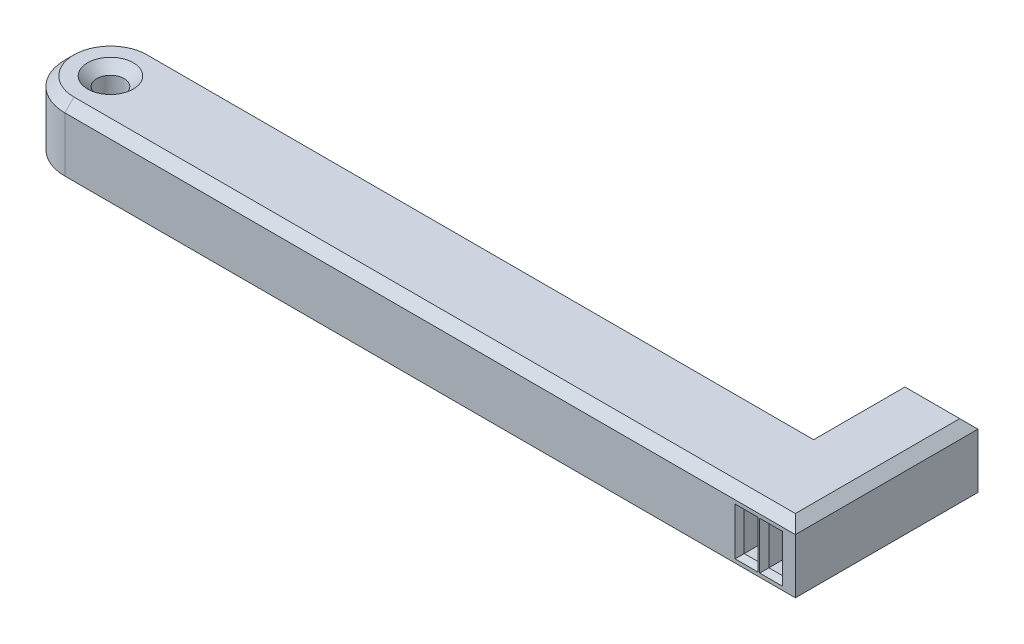
ISO-10303-21;
HEADER;
FILE_DESCRIPTION(('STEP AP214'),'2;1');
FILE_NAME('part.step','',(''),(''),'','','');
FILE_SCHEMA(('AUTOMOTIVE_DESIGN { 1 0 10303 214 1 1 1 1 }'));
ENDSEC;
DATA;
#1=APPLICATION_CONTEXT('core data for automotive mechanical design processes');
#2=APPLICATION_PROTOCOL_DEFINITION('international standard','automotive_design',2000,#1);
#3=PRODUCT_CONTEXT('',#1,'mechanical');
#4=PRODUCT('Part','Part','',(#3));
#5=PRODUCT_RELATED_PRODUCT_CATEGORY('part','',(#4));
#6=PRODUCT_DEFINITION_FORMATION('','',#4);
#7=PRODUCT_DEFINITION_CONTEXT('part definition',#1,'design');
#8=PRODUCT_DEFINITION('design','',#6,#7);
#9=PRODUCT_DEFINITION_SHAPE('','',#8);
#10=(LENGTH_UNIT() NAMED_UNIT(*) SI_UNIT(.MILLI.,.METRE.));
#11=(NAMED_UNIT(*) PLANE_ANGLE_UNIT() SI_UNIT($,.RADIAN.));
#12=(NAMED_UNIT(*) SI_UNIT($,.STERADIAN.) SOLID_ANGLE_UNIT());
#13=UNCERTAINTY_MEASURE_WITH_UNIT(LENGTH_MEASURE(1.E-05),#10,'distance_accuracy_value','');
#14=(GEOMETRIC_REPRESENTATION_CONTEXT(3) GLOBAL_UNCERTAINTY_ASSIGNED_CONTEXT((#13)) GLOBAL_UNIT_ASSIGNED_CONTEXT((#10,
#11,#12)) REPRESENTATION_CONTEXT('',''));
#15=CARTESIAN_POINT('',(0.,0.,0.));
#16=DIRECTION('',(0.,0.,1.));
#17=DIRECTION('',(1.,0.,0.));
#18=AXIS2_PLACEMENT_3D('',#15,#16,#17);
#19=CARTESIAN_POINT('',(0.,8.,-5.));
#20=DIRECTION('',(0.,0.,-1.));
#21=DIRECTION('',(-1.,0.,0.));
#22=AXIS2_PLACEMENT_3D('',#19,#20,#21);
#23=PLANE('',#22);
#24=DIRECTION('',(0.,-1.,0.));
#25=VECTOR('',#24,1.);
#26=CARTESIAN_POINT('',(0.,8.,-5.));
#27=LINE('',#26,#25);
#28=CARTESIAN_POINT('',(0.,7.00000000000001,-5.));
#29=VERTEX_POINT('',#28);
#30=CARTESIAN_POINT('',(0.,0.999999999999994,-5.));
#31=VERTEX_POINT('',#30);
#32=EDGE_CURVE('E291',#29,#31,#27,.T.);
#33=ORIENTED_EDGE('',*,*,#32,.F.);
#34=DIRECTION('',(1.,0.,0.));
#35=VECTOR('',#34,1.);
#36=CARTESIAN_POINT('',(0.,7.00000000000001,-5.));
#37=LINE('',#36,#35);
#38=CARTESIAN_POINT('',(72.,7.00000000000001,-4.99999999999999));
#39=VERTEX_POINT('',#38);
#40=EDGE_CURVE('E361',#29,#39,#37,.T.);
#41=ORIENTED_EDGE('',*,*,#40,.T.);
#42=DIRECTION('',(0.,-1.,0.));
#43=VECTOR('',#42,1.);
#44=CARTESIAN_POINT('',(72.,8.,-4.99999999999999));
#45=LINE('',#44,#43);
#46=CARTESIAN_POINT('',(72.,0.999999999999994,-4.99999999999999));
#47=VERTEX_POINT('',#46);
#48=EDGE_CURVE('E264',#39,#47,#45,.T.);
#49=ORIENTED_EDGE('',*,*,#48,.T.);
#50=DIRECTION('',(-1.,0.,0.));
#51=VECTOR('',#50,1.);
#52=CARTESIAN_POINT('',(0.,0.999999999999994,-5.));
#53=LINE('',#52,#51);
#54=EDGE_CURVE('E358',#47,#31,#53,.T.);
#55=ORIENTED_EDGE('',*,*,#54,.T.);
#56=EDGE_LOOP('',(#33,#41,#49,#55));
#57=FACE_BOUND('',#56,.T.);
#58=ADVANCED_FACE('F43',(#57),#23,.T.);
#59=CARTESIAN_POINT('',(0.,8.,0.));
#60=DIRECTION('',(0.,-1.,0.));
#61=DIRECTION('',(0.,0.,-1.));
#62=AXIS2_PLACEMENT_3D('',#59,#60,#61);
#63=CYLINDRICAL_SURFACE('',#62,5.);
#64=DIRECTION('',(0.,-1.,0.));
#65=VECTOR('',#64,1.);
#66=CARTESIAN_POINT('',(0.,8.,5.));
#67=LINE('',#66,#65);
#68=CARTESIAN_POINT('',(0.,7.00000000000001,5.));
#69=VERTEX_POINT('',#68);
#70=CARTESIAN_POINT('',(0.,0.999999999999994,5.));
#71=VERTEX_POINT('',#70);
#72=EDGE_CURVE('E287',#69,#71,#67,.T.);
#73=ORIENTED_EDGE('',*,*,#72,.F.);
#74=CARTESIAN_POINT('',(0.,7.00000000000001,0.));
#75=DIRECTION('',(0.,1.,0.));
#76=DIRECTION('',(0.,0.,1.));
#77=AXIS2_PLACEMENT_3D('',#74,#75,#76);
#78=CIRCLE('',#77,5.);
#79=EDGE_CURVE('E355',#69,#29,#78,.F.);
#80=ORIENTED_EDGE('',*,*,#79,.T.);
#81=ORIENTED_EDGE('',*,*,#32,.T.);
#82=CARTESIAN_POINT('',(0.,0.999999999999994,0.));
#83=DIRECTION('',(0.,1.,0.));
#84=DIRECTION('',(0.,0.,1.));
#85=AXIS2_PLACEMENT_3D('',#82,#83,#84);
#86=CIRCLE('',#85,5.);
#87=EDGE_CURVE('E351',#31,#71,#86,.T.);
#88=ORIENTED_EDGE('',*,*,#87,.T.);
#89=EDGE_LOOP('',(#73,#80,#81,#88));
#90=FACE_BOUND('',#89,.T.);
#91=ADVANCED_FACE('F599',(#90),#63,.T.);
#92=CARTESIAN_POINT('',(0.,8.,5.));
#93=DIRECTION('',(0.,0.,1.));
#94=DIRECTION('',(1.,0.,0.));
#95=AXIS2_PLACEMENT_3D('',#92,#93,#94);
#96=PLANE('',#95);
#97=DIRECTION('',(0.,1.,0.));
#98=VECTOR('',#97,1.);
#99=CARTESIAN_POINT('',(73.4,6.1,4.99999999999999));
#100=LINE('',#99,#98);
#101=CARTESIAN_POINT('',(73.4,1.4,4.99999999999999));
#102=VERTEX_POINT('',#101);
#103=CARTESIAN_POINT('',(73.4,6.6,4.99999999999999));
#104=VERTEX_POINT('',#103);
#105=EDGE_CURVE('E451',#102,#104,#100,.T.);
#106=ORIENTED_EDGE('',*,*,#105,.T.);
#107=DIRECTION('',(1.,0.,0.));
#108=VECTOR('',#107,1.);
#109=CARTESIAN_POINT('',(75.4,6.6,4.99999999999999));
#110=LINE('',#109,#108);
#111=CARTESIAN_POINT('',(75.9,6.6,4.99999999999999));
#112=VERTEX_POINT('',#111);
#113=EDGE_CURVE('E454',#104,#112,#110,.T.);
#114=ORIENTED_EDGE('',*,*,#113,.T.);
#115=DIRECTION('',(0.,-1.,0.));
#116=VECTOR('',#115,1.);
#117=CARTESIAN_POINT('',(75.9,1.9,4.99999999999999));
#118=LINE('',#117,#116);
#119=CARTESIAN_POINT('',(75.9,1.4,4.99999999999999));
#120=VERTEX_POINT('',#119);
#121=EDGE_CURVE('E445',#112,#120,#118,.T.);
#122=ORIENTED_EDGE('',*,*,#121,.T.);
#123=DIRECTION('',(-1.,0.,0.));
#124=VECTOR('',#123,1.);
#125=CARTESIAN_POINT('',(73.9,1.4,4.99999999999999));
#126=LINE('',#125,#124);
#127=EDGE_CURVE('E448',#120,#102,#126,.T.);
#128=ORIENTED_EDGE('',*,*,#127,.T.);
#129=EDGE_LOOP('',(#106,#114,#122,#128));
#130=FACE_BOUND('',#129,.T.);
#131=DIRECTION('',(0.,1.,0.));
#132=VECTOR('',#131,1.);
#133=CARTESIAN_POINT('',(76.1,6.1,4.99999999999999));
#134=LINE('',#133,#132);
#135=CARTESIAN_POINT('',(76.1,1.4,4.99999999999999));
#136=VERTEX_POINT('',#135);
#137=CARTESIAN_POINT('',(76.1,6.6,4.99999999999999));
#138=VERTEX_POINT('',#137);
#139=EDGE_CURVE('E438',#136,#138,#134,.T.);
#140=ORIENTED_EDGE('',*,*,#139,.T.);
#141=DIRECTION('',(1.,0.,0.));
#142=VECTOR('',#141,1.);
#143=CARTESIAN_POINT('',(78.1,6.6,4.99999999999999));
#144=LINE('',#143,#142);
#145=CARTESIAN_POINT('',(78.6,6.6,4.99999999999999));
#146=VERTEX_POINT('',#145);
#147=EDGE_CURVE('E441',#138,#146,#144,.T.);
#148=ORIENTED_EDGE('',*,*,#147,.T.);
#149=DIRECTION('',(0.,-1.,0.));
#150=VECTOR('',#149,1.);
#151=CARTESIAN_POINT('',(78.6,1.9,4.99999999999999));
#152=LINE('',#151,#150);
#153=CARTESIAN_POINT('',(78.6,1.4,4.99999999999999));
#154=VERTEX_POINT('',#153);
#155=EDGE_CURVE('E387',#146,#154,#152,.T.);
#156=ORIENTED_EDGE('',*,*,#155,.T.);
#157=DIRECTION('',(-1.,0.,0.));
#158=VECTOR('',#157,1.);
#159=CARTESIAN_POINT('',(76.6,1.4,4.99999999999999));
#160=LINE('',#159,#158);
#161=EDGE_CURVE('E435',#154,#136,#160,.T.);
#162=ORIENTED_EDGE('',*,*,#161,.T.);
#163=EDGE_LOOP('',(#140,#148,#156,#162));
#164=FACE_BOUND('',#163,.T.);
#165=DIRECTION('',(0.,-1.,0.));
#166=VECTOR('',#165,1.);
#167=CARTESIAN_POINT('',(80.,8.,4.99999999999999));
#168=LINE('',#167,#166);
#169=CARTESIAN_POINT('',(80.,7.00000000000001,4.99999999999999));
#170=VERTEX_POINT('',#169);
#171=CARTESIAN_POINT('',(80.,0.999999999999994,4.99999999999999));
#172=VERTEX_POINT('',#171);
#173=EDGE_CURVE('E283',#170,#172,#168,.T.);
#174=ORIENTED_EDGE('',*,*,#173,.F.);
#175=DIRECTION('',(-1.,0.,0.));
#176=VECTOR('',#175,1.);
#177=CARTESIAN_POINT('',(0.,7.00000000000001,5.));
#178=LINE('',#177,#176);
#179=EDGE_CURVE('E348',#170,#69,#178,.T.);
#180=ORIENTED_EDGE('',*,*,#179,.T.);
#181=ORIENTED_EDGE('',*,*,#72,.T.);
#182=DIRECTION('',(1.,0.,0.));
#183=VECTOR('',#182,1.);
#184=CARTESIAN_POINT('',(80.,0.999999999999994,4.99999999999999));
#185=LINE('',#184,#183);
#186=EDGE_CURVE('E345',#71,#172,#185,.T.);
#187=ORIENTED_EDGE('',*,*,#186,.T.);
#188=EDGE_LOOP('',(#174,#180,#181,#187));
#189=FACE_BOUND('',#188,.T.);
#190=ADVANCED_FACE('F573',(#130,#164,#189),#96,.T.);
#191=CARTESIAN_POINT('',(80.,8.,0.));
#192=DIRECTION('',(1.,0.,0.));
#193=DIRECTION('',(0.,0.,-1.));
#194=AXIS2_PLACEMENT_3D('',#191,#192,#193);
#195=PLANE('',#194);
#196=DIRECTION('',(0.,-1.,0.));
#197=VECTOR('',#196,1.);
#198=CARTESIAN_POINT('',(80.,8.,-15.));
#199=LINE('',#198,#197);
#200=CARTESIAN_POINT('',(80.,7.00000000000001,-15.));
#201=VERTEX_POINT('',#200);
#202=CARTESIAN_POINT('',(80.,0.999999999999994,-15.));
#203=VERTEX_POINT('',#202);
#204=EDGE_CURVE('E279',#201,#203,#199,.T.);
#205=ORIENTED_EDGE('',*,*,#204,.F.);
#206=DIRECTION('',(0.,0.,1.));
#207=VECTOR('',#206,1.);
#208=CARTESIAN_POINT('',(80.,7.00000000000001,0.));
#209=LINE('',#208,#207);
#210=EDGE_CURVE('E342',#201,#170,#209,.T.);
#211=ORIENTED_EDGE('',*,*,#210,.T.);
#212=ORIENTED_EDGE('',*,*,#173,.T.);
#213=DIRECTION('',(0.,0.,-1.));
#214=VECTOR('',#213,1.);
#215=CARTESIAN_POINT('',(80.,0.999999999999994,-15.));
#216=LINE('',#215,#214);
#217=EDGE_CURVE('E339',#172,#203,#216,.T.);
#218=ORIENTED_EDGE('',*,*,#217,.T.);
#219=EDGE_LOOP('',(#205,#211,#212,#218));
#220=FACE_BOUND('',#219,.T.);
#221=ADVANCED_FACE('F947',(#220),#195,.T.);
#222=CARTESIAN_POINT('',(0.,8.,-15.));
#223=DIRECTION('',(0.,0.,1.));
#224=DIRECTION('',(1.,0.,0.));
#225=AXIS2_PLACEMENT_3D('',#222,#223,#224);
#226=PLANE('',#225);
#227=DIRECTION('',(-1.,0.,0.));
#228=VECTOR('',#227,1.);
#229=CARTESIAN_POINT('',(0.,6.59999999999999,-15.));
#230=LINE('',#229,#228);
#231=CARTESIAN_POINT('',(78.6,6.59999999999999,-15.));
#232=VERTEX_POINT('',#231);
#233=CARTESIAN_POINT('',(73.4,6.59999999999999,-15.));
#234=VERTEX_POINT('',#233);
#235=EDGE_CURVE('E495',#232,#234,#230,.T.);
#236=ORIENTED_EDGE('',*,*,#235,.T.);
#237=DIRECTION('',(0.,-1.,0.));
#238=VECTOR('',#237,1.);
#239=CARTESIAN_POINT('',(73.4,8.,-15.));
#240=LINE('',#239,#238);
#241=CARTESIAN_POINT('',(73.4,1.40000000000001,-15.));
#242=VERTEX_POINT('',#241);
#243=EDGE_CURVE('E11',#234,#242,#240,.T.);
#244=ORIENTED_EDGE('',*,*,#243,.T.);
#245=DIRECTION('',(1.,0.,0.));
#246=VECTOR('',#245,1.);
#247=CARTESIAN_POINT('',(0.,1.40000000000001,-15.));
#248=LINE('',#247,#246);
#249=CARTESIAN_POINT('',(78.6,1.40000000000001,-15.));
#250=VERTEX_POINT('',#249);
#251=EDGE_CURVE('E54',#242,#250,#248,.T.);
#252=ORIENTED_EDGE('',*,*,#251,.T.);
#253=DIRECTION('',(0.,1.,0.));
#254=VECTOR('',#253,1.);
#255=CARTESIAN_POINT('',(78.6,8.,-15.));
#256=LINE('',#255,#254);
#257=EDGE_CURVE('E498',#250,#232,#256,.T.);
#258=ORIENTED_EDGE('',*,*,#257,.T.);
#259=EDGE_LOOP('',(#236,#244,#252,#258));
#260=FACE_BOUND('',#259,.T.);
#261=DIRECTION('',(0.,-1.,0.));
#262=VECTOR('',#261,1.);
#263=CARTESIAN_POINT('',(72.,8.,-15.));
#264=LINE('',#263,#262);
#265=CARTESIAN_POINT('',(72.,7.00000000000001,-15.));
#266=VERTEX_POINT('',#265);
#267=CARTESIAN_POINT('',(72.,0.999999999999994,-15.));
#268=VERTEX_POINT('',#267);
#269=EDGE_CURVE('E275',#266,#268,#264,.T.);
#270=ORIENTED_EDGE('',*,*,#269,.F.);
#271=DIRECTION('',(1.,0.,0.));
#272=VECTOR('',#271,1.);
#273=CARTESIAN_POINT('',(80.,7.00000000000001,-15.));
#274=LINE('',#273,#272);
#275=EDGE_CURVE('E336',#266,#201,#274,.T.);
#276=ORIENTED_EDGE('',*,*,#275,.T.);
#277=ORIENTED_EDGE('',*,*,#204,.T.);
#278=DIRECTION('',(-1.,0.,0.));
#279=VECTOR('',#278,1.);
#280=CARTESIAN_POINT('',(0.,0.999999999999994,-15.));
#281=LINE('',#280,#279);
#282=EDGE_CURVE('E333',#203,#268,#281,.T.);
#283=ORIENTED_EDGE('',*,*,#282,.T.);
#284=EDGE_LOOP('',(#270,#276,#277,#283));
#285=FACE_BOUND('',#284,.T.);
#286=ADVANCED_FACE('F549',(#260,#285),#226,.F.);
#287=CARTESIAN_POINT('',(72.,8.,0.));
#288=DIRECTION('',(-1.,0.,0.));
#289=DIRECTION('',(0.,0.,1.));
#290=AXIS2_PLACEMENT_3D('',#287,#288,#289);
#291=PLANE('',#290);
#292=ORIENTED_EDGE('',*,*,#48,.F.);
#293=DIRECTION('',(0.,0.,-1.));
#294=VECTOR('',#293,1.);
#295=CARTESIAN_POINT('',(72.,7.00000000000001,0.));
#296=LINE('',#295,#294);
#297=EDGE_CURVE('E329',#39,#266,#296,.T.);
#298=ORIENTED_EDGE('',*,*,#297,.T.);
#299=ORIENTED_EDGE('',*,*,#269,.T.);
#300=DIRECTION('',(0.,0.,1.));
#301=VECTOR('',#300,1.);
#302=CARTESIAN_POINT('',(72.,0.999999999999994,-4.99999999999999));
#303=LINE('',#302,#301);
#304=EDGE_CURVE('E326',#268,#47,#303,.T.);
#305=ORIENTED_EDGE('',*,*,#304,.T.);
#306=EDGE_LOOP('',(#292,#298,#299,#305));
#307=FACE_BOUND('',#306,.T.);
#308=ADVANCED_FACE('F946',(#307),#291,.T.);
#309=CARTESIAN_POINT('',(0.,8.,0.));
#310=DIRECTION('',(0.,-1.,0.));
#311=DIRECTION('',(0.,0.,-1.));
#312=AXIS2_PLACEMENT_3D('',#309,#310,#311);
#313=CYLINDRICAL_SURFACE('',#312,1.5);
#314=CARTESIAN_POINT('',(0.,7.,0.));
#315=DIRECTION('',(0.,1.,0.));
#316=DIRECTION('',(0.,0.,1.));
#317=AXIS2_PLACEMENT_3D('',#314,#315,#316);
#318=CIRCLE('',#317,1.5);
#319=CARTESIAN_POINT('',(0.,7.,1.5));
#320=VERTEX_POINT('',#319);
#321=EDGE_CURVE('E299',#320,#320,#318,.T.);
#322=ORIENTED_EDGE('',*,*,#321,.T.);
#323=EDGE_LOOP('',(#322));
#324=FACE_BOUND('',#323,.T.);
#325=CARTESIAN_POINT('',(0.,0.999999999999997,0.));
#326=DIRECTION('',(0.,1.,0.));
#327=DIRECTION('',(0.,0.,1.));
#328=AXIS2_PLACEMENT_3D('',#325,#326,#327);
#329=CIRCLE('',#328,1.5);
#330=CARTESIAN_POINT('',(0.,0.999999999999997,1.5));
#331=VERTEX_POINT('',#330);
#332=EDGE_CURVE('E295',#331,#331,#329,.F.);
#333=ORIENTED_EDGE('',*,*,#332,.T.);
#334=EDGE_LOOP('',(#333));
#335=FACE_BOUND('',#334,.T.);
#336=ADVANCED_FACE('F977',(#324,#335),#313,.F.);
#337=CARTESIAN_POINT('',(0.,8.,0.));
#338=DIRECTION('',(0.,1.,0.));
#339=DIRECTION('',(0.,0.,1.));
#340=AXIS2_PLACEMENT_3D('',#337,#338,#339);
#341=PLANE('',#340);
#342=CARTESIAN_POINT('',(0.,8.,0.));
#343=DIRECTION('',(0.,1.,0.));
#344=DIRECTION('',(0.,0.,1.));
#345=AXIS2_PLACEMENT_3D('',#342,#343,#344);
#346=CIRCLE('',#345,2.49999999999999);
#347=CARTESIAN_POINT('',(0.,8.,2.49999999999999));
#348=VERTEX_POINT('',#347);
#349=EDGE_CURVE('E322',#348,#348,#346,.F.);
#350=ORIENTED_EDGE('',*,*,#349,.T.);
#351=EDGE_LOOP('',(#350));
#352=FACE_BOUND('',#351,.T.);
#353=DIRECTION('',(-1.,0.,0.));
#354=VECTOR('',#353,1.);
#355=CARTESIAN_POINT('',(72.,8.,-14.));
#356=LINE('',#355,#354);
#357=CARTESIAN_POINT('',(79.,8.,-14.));
#358=VERTEX_POINT('',#357);
#359=CARTESIAN_POINT('',(73.,8.,-14.));
#360=VERTEX_POINT('',#359);
#361=EDGE_CURVE('E315',#358,#360,#356,.T.);
#362=ORIENTED_EDGE('',*,*,#361,.T.);
#363=DIRECTION('',(0.,0.,1.));
#364=VECTOR('',#363,1.);
#365=CARTESIAN_POINT('',(73.,8.,0.));
#366=LINE('',#365,#364);
#367=CARTESIAN_POINT('',(73.,8.,-3.99999999999999));
#368=VERTEX_POINT('',#367);
#369=EDGE_CURVE('E318',#360,#368,#366,.T.);
#370=ORIENTED_EDGE('',*,*,#369,.T.);
#371=DIRECTION('',(-1.,0.,0.));
#372=VECTOR('',#371,1.);
#373=CARTESIAN_POINT('',(0.,8.,-4.));
#374=LINE('',#373,#372);
#375=CARTESIAN_POINT('',(0.,8.,-4.));
#376=VERTEX_POINT('',#375);
#377=EDGE_CURVE('E303',#368,#376,#374,.T.);
#378=ORIENTED_EDGE('',*,*,#377,.T.);
#379=CARTESIAN_POINT('',(0.,8.,0.));
#380=DIRECTION('',(0.,1.,0.));
#381=DIRECTION('',(0.,0.,1.));
#382=AXIS2_PLACEMENT_3D('',#379,#380,#381);
#383=CIRCLE('',#382,4.);
#384=CARTESIAN_POINT('',(0.,8.,4.));
#385=VERTEX_POINT('',#384);
#386=EDGE_CURVE('E306',#376,#385,#383,.T.);
#387=ORIENTED_EDGE('',*,*,#386,.T.);
#388=DIRECTION('',(1.,0.,0.));
#389=VECTOR('',#388,1.);
#390=CARTESIAN_POINT('',(0.,8.,4.));
#391=LINE('',#390,#389);
#392=CARTESIAN_POINT('',(79.,8.,3.99999999999999));
#393=VERTEX_POINT('',#392);
#394=EDGE_CURVE('E309',#385,#393,#391,.T.);
#395=ORIENTED_EDGE('',*,*,#394,.T.);
#396=DIRECTION('',(0.,0.,-1.));
#397=VECTOR('',#396,1.);
#398=CARTESIAN_POINT('',(79.,8.,0.));
#399=LINE('',#398,#397);
#400=EDGE_CURVE('E312',#393,#358,#399,.T.);
#401=ORIENTED_EDGE('',*,*,#400,.T.);
#402=EDGE_LOOP('',(#362,#370,#378,#387,#395,#401));
#403=FACE_BOUND('',#402,.T.);
#404=ADVANCED_FACE('F987',(#352,#403),#341,.T.);
#405=CARTESIAN_POINT('',(0.,0.,0.));
#406=DIRECTION('',(0.,1.,0.));
#407=DIRECTION('',(0.,0.,1.));
#408=AXIS2_PLACEMENT_3D('',#405,#406,#407);
#409=PLANE('',#408);
#410=CARTESIAN_POINT('',(0.,0.,0.));
#411=DIRECTION('',(0.,1.,0.));
#412=DIRECTION('',(0.,0.,1.));
#413=AXIS2_PLACEMENT_3D('',#410,#411,#412);
#414=CIRCLE('',#413,2.49999999999998);
#415=CARTESIAN_POINT('',(0.,0.,2.49999999999998));
#416=VERTEX_POINT('',#415);
#417=EDGE_CURVE('E383',#416,#416,#414,.T.);
#418=ORIENTED_EDGE('',*,*,#417,.T.);
#419=EDGE_LOOP('',(#418));
#420=FACE_BOUND('',#419,.T.);
#421=DIRECTION('',(-1.,0.,0.));
#422=VECTOR('',#421,1.);
#423=CARTESIAN_POINT('',(0.,0.,4.00000000000001));
#424=LINE('',#423,#422);
#425=CARTESIAN_POINT('',(79.,0.,4.));
#426=VERTEX_POINT('',#425);
#427=CARTESIAN_POINT('',(0.,0.,4.00000000000001));
#428=VERTEX_POINT('',#427);
#429=EDGE_CURVE('E376',#426,#428,#424,.T.);
#430=ORIENTED_EDGE('',*,*,#429,.T.);
#431=CARTESIAN_POINT('',(0.,0.,0.));
#432=DIRECTION('',(0.,1.,0.));
#433=DIRECTION('',(0.,0.,1.));
#434=AXIS2_PLACEMENT_3D('',#431,#432,#433);
#435=CIRCLE('',#434,4.00000000000001);
#436=CARTESIAN_POINT('',(0.,0.,-4.00000000000001));
#437=VERTEX_POINT('',#436);
#438=EDGE_CURVE('E379',#428,#437,#435,.F.);
#439=ORIENTED_EDGE('',*,*,#438,.T.);
#440=DIRECTION('',(1.,0.,0.));
#441=VECTOR('',#440,1.);
#442=CARTESIAN_POINT('',(72.,0.,-4.));
#443=LINE('',#442,#441);
#444=CARTESIAN_POINT('',(73.,0.,-4.));
#445=VERTEX_POINT('',#444);
#446=EDGE_CURVE('E364',#437,#445,#443,.T.);
#447=ORIENTED_EDGE('',*,*,#446,.T.);
#448=DIRECTION('',(0.,0.,-1.));
#449=VECTOR('',#448,1.);
#450=CARTESIAN_POINT('',(73.,0.,-15.));
#451=LINE('',#450,#449);
#452=CARTESIAN_POINT('',(73.,0.,-14.));
#453=VERTEX_POINT('',#452);
#454=EDGE_CURVE('E367',#445,#453,#451,.T.);
#455=ORIENTED_EDGE('',*,*,#454,.T.);
#456=DIRECTION('',(1.,0.,0.));
#457=VECTOR('',#456,1.);
#458=CARTESIAN_POINT('',(0.,0.,-14.));
#459=LINE('',#458,#457);
#460=CARTESIAN_POINT('',(79.,0.,-14.));
#461=VERTEX_POINT('',#460);
#462=EDGE_CURVE('E370',#453,#461,#459,.T.);
#463=ORIENTED_EDGE('',*,*,#462,.T.);
#464=DIRECTION('',(0.,0.,1.));
#465=VECTOR('',#464,1.);
#466=CARTESIAN_POINT('',(79.,0.,4.99999999999999));
#467=LINE('',#466,#465);
#468=EDGE_CURVE('E373',#461,#426,#467,.T.);
#469=ORIENTED_EDGE('',*,*,#468,.T.);
#470=EDGE_LOOP('',(#430,#439,#447,#455,#463,#469));
#471=FACE_BOUND('',#470,.T.);
#472=ADVANCED_FACE('F934',(#420,#471),#409,.F.);
#473=CARTESIAN_POINT('',(78.1,6.1,-11.5));
#474=DIRECTION('',(1.,0.,0.));
#475=DIRECTION('',(0.,0.,-1.));
#476=AXIS2_PLACEMENT_3D('',#473,#474,#475);
#477=PLANE('',#476);
#478=DIRECTION('',(0.,0.,-1.));
#479=VECTOR('',#478,1.);
#480=CARTESIAN_POINT('',(78.1,1.9,-11.5));
#481=LINE('',#480,#479);
#482=CARTESIAN_POINT('',(78.1,1.9,4.5));
#483=VERTEX_POINT('',#482);
#484=CARTESIAN_POINT('',(78.1,1.9,-14.5));
#485=VERTEX_POINT('',#484);
#486=EDGE_CURVE('E250',#483,#485,#481,.T.);
#487=ORIENTED_EDGE('',*,*,#486,.F.);
#488=DIRECTION('',(0.,1.,0.));
#489=VECTOR('',#488,1.);
#490=CARTESIAN_POINT('',(78.1,6.1,4.5));
#491=LINE('',#490,#489);
#492=CARTESIAN_POINT('',(78.1,6.1,4.5));
#493=VERTEX_POINT('',#492);
#494=EDGE_CURVE('E492',#483,#493,#491,.T.);
#495=ORIENTED_EDGE('',*,*,#494,.T.);
#496=DIRECTION('',(0.,0.,-1.));
#497=VECTOR('',#496,1.);
#498=CARTESIAN_POINT('',(78.1,6.1,-11.5));
#499=LINE('',#498,#497);
#500=CARTESIAN_POINT('',(78.1,6.1,-14.5));
#501=VERTEX_POINT('',#500);
#502=EDGE_CURVE('E260',#493,#501,#499,.T.);
#503=ORIENTED_EDGE('',*,*,#502,.T.);
#504=DIRECTION('',(0.,-1.,0.));
#505=VECTOR('',#504,1.);
#506=CARTESIAN_POINT('',(78.1,6.1,-14.5));
#507=LINE('',#506,#505);
#508=EDGE_CURVE('E489',#501,#485,#507,.T.);
#509=ORIENTED_EDGE('',*,*,#508,.T.);
#510=EDGE_LOOP('',(#487,#495,#503,#509));
#511=FACE_BOUND('',#510,.T.);
#512=ADVANCED_FACE('F924',(#511),#477,.F.);
#513=CARTESIAN_POINT('',(73.9,6.1,-11.5));
#514=DIRECTION('',(0.,1.,0.));
#515=DIRECTION('',(0.,0.,1.));
#516=AXIS2_PLACEMENT_3D('',#513,#514,#515);
#517=PLANE('',#516);
#518=DIRECTION('',(0.,0.,-1.));
#519=VECTOR('',#518,1.);
#520=CARTESIAN_POINT('',(75.4,6.1,5.));
#521=LINE('',#520,#519);
#522=CARTESIAN_POINT('',(75.4,6.1,4.5));
#523=VERTEX_POINT('',#522);
#524=CARTESIAN_POINT('',(75.4,6.1,-11.5));
#525=VERTEX_POINT('',#524);
#526=EDGE_CURVE('E559',#523,#525,#521,.T.);
#527=ORIENTED_EDGE('',*,*,#526,.F.);
#528=DIRECTION('',(-1.,0.,0.));
#529=VECTOR('',#528,1.);
#530=CARTESIAN_POINT('',(73.9,6.1,4.5));
#531=LINE('',#530,#529);
#532=CARTESIAN_POINT('',(73.9,6.1,4.5));
#533=VERTEX_POINT('',#532);
#534=EDGE_CURVE('E463',#523,#533,#531,.T.);
#535=ORIENTED_EDGE('',*,*,#534,.T.);
#536=DIRECTION('',(0.,0.,-1.));
#537=VECTOR('',#536,1.);
#538=CARTESIAN_POINT('',(73.9,6.1,-11.5));
#539=LINE('',#538,#537);
#540=CARTESIAN_POINT('',(73.9,6.1,-14.5));
#541=VERTEX_POINT('',#540);
#542=EDGE_CURVE('E265',#533,#541,#539,.T.);
#543=ORIENTED_EDGE('',*,*,#542,.T.);
#544=DIRECTION('',(1.,0.,0.));
#545=VECTOR('',#544,1.);
#546=CARTESIAN_POINT('',(73.9,6.1,-14.5));
#547=LINE('',#546,#545);
#548=EDGE_CURVE('E458',#541,#501,#547,.T.);
#549=ORIENTED_EDGE('',*,*,#548,.T.);
#550=ORIENTED_EDGE('',*,*,#502,.F.);
#551=DIRECTION('',(-1.,0.,0.));
#552=VECTOR('',#551,1.);
#553=CARTESIAN_POINT('',(76.6,6.1,4.5));
#554=LINE('',#553,#552);
#555=CARTESIAN_POINT('',(76.6,6.1,4.5));
#556=VERTEX_POINT('',#555);
#557=EDGE_CURVE('E229',#493,#556,#554,.T.);
#558=ORIENTED_EDGE('',*,*,#557,.T.);
#559=DIRECTION('',(0.,0.,-1.));
#560=VECTOR('',#559,1.);
#561=CARTESIAN_POINT('',(76.6,6.1,5.));
#562=LINE('',#561,#560);
#563=CARTESIAN_POINT('',(76.6,6.1,-11.5));
#564=VERTEX_POINT('',#563);
#565=EDGE_CURVE('E221',#556,#564,#562,.T.);
#566=ORIENTED_EDGE('',*,*,#565,.T.);
#567=DIRECTION('',(1.,0.,0.));
#568=VECTOR('',#567,1.);
#569=CARTESIAN_POINT('',(73.9,6.1,-11.5));
#570=LINE('',#569,#568);
#571=EDGE_CURVE('E226',#525,#564,#570,.T.);
#572=ORIENTED_EDGE('',*,*,#571,.F.);
#573=EDGE_LOOP('',(#527,#535,#543,#549,#550,#558,#566,#572));
#574=FACE_BOUND('',#573,.T.);
#575=ADVANCED_FACE('F224',(#574),#517,.F.);
#576=CARTESIAN_POINT('',(73.9,1.9,-11.5));
#577=DIRECTION('',(-1.,0.,0.));
#578=DIRECTION('',(0.,0.,1.));
#579=AXIS2_PLACEMENT_3D('',#576,#577,#578);
#580=PLANE('',#579);
#581=ORIENTED_EDGE('',*,*,#542,.F.);
#582=DIRECTION('',(0.,-1.,0.));
#583=VECTOR('',#582,1.);
#584=CARTESIAN_POINT('',(73.9,1.9,4.5));
#585=LINE('',#584,#583);
#586=CARTESIAN_POINT('',(73.9,1.9,4.5));
#587=VERTEX_POINT('',#586);
#588=EDGE_CURVE('E471',#533,#587,#585,.T.);
#589=ORIENTED_EDGE('',*,*,#588,.T.);
#590=DIRECTION('',(0.,0.,-1.));
#591=VECTOR('',#590,1.);
#592=CARTESIAN_POINT('',(73.9,1.9,-11.5));
#593=LINE('',#592,#591);
#594=CARTESIAN_POINT('',(73.9,1.9,-14.5));
#595=VERTEX_POINT('',#594);
#596=EDGE_CURVE('E255',#587,#595,#593,.T.);
#597=ORIENTED_EDGE('',*,*,#596,.T.);
#598=DIRECTION('',(0.,1.,0.));
#599=VECTOR('',#598,1.);
#600=CARTESIAN_POINT('',(73.9,1.9,-14.5));
#601=LINE('',#600,#599);
#602=EDGE_CURVE('E467',#595,#541,#601,.T.);
#603=ORIENTED_EDGE('',*,*,#602,.T.);
#604=EDGE_LOOP('',(#581,#589,#597,#603));
#605=FACE_BOUND('',#604,.T.);
#606=ADVANCED_FACE('F556',(#605),#580,.F.);
#607=CARTESIAN_POINT('',(78.1,1.9,-11.5));
#608=DIRECTION('',(0.,-1.,0.));
#609=DIRECTION('',(0.,0.,-1.));
#610=AXIS2_PLACEMENT_3D('',#607,#608,#609);
#611=PLANE('',#610);
#612=ORIENTED_EDGE('',*,*,#596,.F.);
#613=DIRECTION('',(1.,0.,0.));
#614=VECTOR('',#613,1.);
#615=CARTESIAN_POINT('',(75.4,1.9,4.5));
#616=LINE('',#615,#614);
#617=CARTESIAN_POINT('',(75.4,1.9,4.5));
#618=VERTEX_POINT('',#617);
#619=EDGE_CURVE('E480',#587,#618,#616,.T.);
#620=ORIENTED_EDGE('',*,*,#619,.T.);
#621=DIRECTION('',(0.,0.,-1.));
#622=VECTOR('',#621,1.);
#623=CARTESIAN_POINT('',(75.4,1.9,5.));
#624=LINE('',#623,#622);
#625=CARTESIAN_POINT('',(75.4,1.9,-11.5));
#626=VERTEX_POINT('',#625);
#627=EDGE_CURVE('E243',#618,#626,#624,.T.);
#628=ORIENTED_EDGE('',*,*,#627,.T.);
#629=DIRECTION('',(-1.,0.,0.));
#630=VECTOR('',#629,1.);
#631=CARTESIAN_POINT('',(78.1,1.9,-11.5));
#632=LINE('',#631,#630);
#633=CARTESIAN_POINT('',(76.6,1.9,-11.5));
#634=VERTEX_POINT('',#633);
#635=EDGE_CURVE('E232',#634,#626,#632,.T.);
#636=ORIENTED_EDGE('',*,*,#635,.F.);
#637=DIRECTION('',(0.,0.,-1.));
#638=VECTOR('',#637,1.);
#639=CARTESIAN_POINT('',(76.6,1.9,5.));
#640=LINE('',#639,#638);
#641=CARTESIAN_POINT('',(76.6,1.9,4.5));
#642=VERTEX_POINT('',#641);
#643=EDGE_CURVE('E233',#642,#634,#640,.T.);
#644=ORIENTED_EDGE('',*,*,#643,.F.);
#645=DIRECTION('',(1.,0.,0.));
#646=VECTOR('',#645,1.);
#647=CARTESIAN_POINT('',(78.1,1.9,4.5));
#648=LINE('',#647,#646);
#649=EDGE_CURVE('E477',#642,#483,#648,.T.);
#650=ORIENTED_EDGE('',*,*,#649,.T.);
#651=ORIENTED_EDGE('',*,*,#486,.T.);
#652=DIRECTION('',(-1.,0.,0.));
#653=VECTOR('',#652,1.);
#654=CARTESIAN_POINT('',(78.1,1.9,-14.5));
#655=LINE('',#654,#653);
#656=EDGE_CURVE('E474',#485,#595,#655,.T.);
#657=ORIENTED_EDGE('',*,*,#656,.T.);
#658=EDGE_LOOP('',(#612,#620,#628,#636,#644,#650,#651,#657));
#659=FACE_BOUND('',#658,.T.);
#660=ADVANCED_FACE('F581',(#659),#611,.F.);
#661=CARTESIAN_POINT('',(0.,0.,-11.5));
#662=DIRECTION('',(0.,0.,-1.));
#663=DIRECTION('',(-1.,0.,0.));
#664=AXIS2_PLACEMENT_3D('',#661,#662,#663);
#665=PLANE('',#664);
#666=DIRECTION('',(0.,1.,0.));
#667=VECTOR('',#666,1.);
#668=CARTESIAN_POINT('',(76.6,6.1,-11.5));
#669=LINE('',#668,#667);
#670=EDGE_CURVE('E236',#634,#564,#669,.T.);
#671=ORIENTED_EDGE('',*,*,#670,.F.);
#672=ORIENTED_EDGE('',*,*,#635,.T.);
#673=DIRECTION('',(0.,-1.,0.));
#674=VECTOR('',#673,1.);
#675=CARTESIAN_POINT('',(75.4,6.1,-11.5));
#676=LINE('',#675,#674);
#677=EDGE_CURVE('E248',#525,#626,#676,.T.);
#678=ORIENTED_EDGE('',*,*,#677,.F.);
#679=ORIENTED_EDGE('',*,*,#571,.T.);
#680=EDGE_LOOP('',(#671,#672,#678,#679));
#681=FACE_BOUND('',#680,.T.);
#682=ADVANCED_FACE('F246',(#681),#665,.T.);
#683=CARTESIAN_POINT('',(75.4,6.1,5.));
#684=DIRECTION('',(1.,0.,0.));
#685=DIRECTION('',(0.,0.,-1.));
#686=AXIS2_PLACEMENT_3D('',#683,#684,#685);
#687=PLANE('',#686);
#688=ORIENTED_EDGE('',*,*,#627,.F.);
#689=DIRECTION('',(0.,1.,0.));
#690=VECTOR('',#689,1.);
#691=CARTESIAN_POINT('',(75.4,6.1,4.5));
#692=LINE('',#691,#690);
#693=EDGE_CURVE('E483',#618,#523,#692,.T.);
#694=ORIENTED_EDGE('',*,*,#693,.T.);
#695=ORIENTED_EDGE('',*,*,#526,.T.);
#696=ORIENTED_EDGE('',*,*,#677,.T.);
#697=EDGE_LOOP('',(#688,#694,#695,#696));
#698=FACE_BOUND('',#697,.T.);
#699=ADVANCED_FACE('F887',(#698),#687,.F.);
#700=CARTESIAN_POINT('',(76.6,6.1,5.));
#701=DIRECTION('',(-1.,0.,0.));
#702=DIRECTION('',(0.,0.,1.));
#703=AXIS2_PLACEMENT_3D('',#700,#701,#702);
#704=PLANE('',#703);
#705=ORIENTED_EDGE('',*,*,#565,.F.);
#706=DIRECTION('',(0.,-1.,0.));
#707=VECTOR('',#706,1.);
#708=CARTESIAN_POINT('',(76.6,1.9,4.5));
#709=LINE('',#708,#707);
#710=EDGE_CURVE('E486',#556,#642,#709,.T.);
#711=ORIENTED_EDGE('',*,*,#710,.T.);
#712=ORIENTED_EDGE('',*,*,#643,.T.);
#713=ORIENTED_EDGE('',*,*,#670,.T.);
#714=EDGE_LOOP('',(#705,#711,#712,#713));
#715=FACE_BOUND('',#714,.T.);
#716=ADVANCED_FACE('F237',(#715),#704,.F.);
#717=CARTESIAN_POINT('',(0.,7.,0.));
#718=DIRECTION('',(0.,1.,0.));
#719=DIRECTION('',(0.,0.,1.));
#720=AXIS2_PLACEMENT_3D('',#717,#718,#719);
#721=CONICAL_SURFACE('',#720,1.5,0.785398163397442);
#722=ORIENTED_EDGE('',*,*,#349,.F.);
#723=EDGE_LOOP('',(#722));
#724=FACE_BOUND('',#723,.T.);
#725=ORIENTED_EDGE('',*,*,#321,.F.);
#726=EDGE_LOOP('',(#725));
#727=FACE_BOUND('',#726,.T.);
#728=ADVANCED_FACE('F611',(#724,#727),#721,.F.);
#729=CARTESIAN_POINT('',(0.,7.00000000000001,5.));
#730=DIRECTION('',(0.,-0.70710678118655,-0.707106781186545));
#731=DIRECTION('',(-1.,0.,0.));
#732=AXIS2_PLACEMENT_3D('',#729,#730,#731);
#733=PLANE('',#732);
#734=DIRECTION('',(-0.577350269189627,0.577350269189623,-0.577350269189627));
#735=VECTOR('',#734,1.);
#736=CARTESIAN_POINT('',(53.3333333333332,33.6666666666666,-21.6666666666668));
#737=LINE('',#736,#735);
#738=EDGE_CURVE('E403',#393,#170,#737,.F.);
#739=ORIENTED_EDGE('',*,*,#738,.F.);
#740=ORIENTED_EDGE('',*,*,#394,.F.);
#741=DIRECTION('',(0.,0.707106781186545,-0.70710678118655));
#742=VECTOR('',#741,1.);
#743=CARTESIAN_POINT('',(0.,7.00000000000001,5.));
#744=LINE('',#743,#742);
#745=EDGE_CURVE('E407',#69,#385,#744,.T.);
#746=ORIENTED_EDGE('',*,*,#745,.F.);
#747=ORIENTED_EDGE('',*,*,#179,.F.);
#748=EDGE_LOOP('',(#739,#740,#746,#747));
#749=FACE_BOUND('',#748,.T.);
#750=ADVANCED_FACE('F617',(#749),#733,.F.);
#751=CARTESIAN_POINT('',(0.,8.,0.));
#752=DIRECTION('',(0.,-1.,0.));
#753=DIRECTION('',(0.,0.,-1.));
#754=AXIS2_PLACEMENT_3D('',#751,#752,#753);
#755=CONICAL_SURFACE('',#754,4.,0.785398163397452);
#756=ORIENTED_EDGE('',*,*,#745,.T.);
#757=ORIENTED_EDGE('',*,*,#386,.F.);
#758=DIRECTION('',(0.,0.707106781186545,0.70710678118655));
#759=VECTOR('',#758,1.);
#760=CARTESIAN_POINT('',(0.,7.00000000000001,-5.));
#761=LINE('',#760,#759);
#762=EDGE_CURVE('E399',#29,#376,#761,.T.);
#763=ORIENTED_EDGE('',*,*,#762,.F.);
#764=ORIENTED_EDGE('',*,*,#79,.F.);
#765=EDGE_LOOP('',(#756,#757,#763,#764));
#766=FACE_BOUND('',#765,.T.);
#767=ADVANCED_FACE('F649',(#766),#755,.T.);
#768=CARTESIAN_POINT('',(80.,7.00000000000001,0.));
#769=DIRECTION('',(-0.707106781186545,-0.70710678118655,0.));
#770=DIRECTION('',(0.,0.,1.));
#771=AXIS2_PLACEMENT_3D('',#768,#769,#770);
#772=PLANE('',#771);
#773=ORIENTED_EDGE('',*,*,#738,.T.);
#774=ORIENTED_EDGE('',*,*,#210,.F.);
#775=DIRECTION('',(0.577350269189627,-0.577350269189623,-0.577350269189627));
#776=VECTOR('',#775,1.);
#777=CARTESIAN_POINT('',(75.,12.,-9.99999999999997));
#778=LINE('',#777,#776);
#779=EDGE_CURVE('E395',#358,#201,#778,.T.);
#780=ORIENTED_EDGE('',*,*,#779,.F.);
#781=ORIENTED_EDGE('',*,*,#400,.F.);
#782=EDGE_LOOP('',(#773,#774,#780,#781));
#783=FACE_BOUND('',#782,.T.);
#784=ADVANCED_FACE('F642',(#783),#772,.F.);
#785=CARTESIAN_POINT('',(0.,7.00000000000001,-5.));
#786=DIRECTION('',(0.,-0.70710678118655,0.707106781186545));
#787=DIRECTION('',(1.,0.,0.));
#788=AXIS2_PLACEMENT_3D('',#785,#786,#787);
#789=PLANE('',#788);
#790=ORIENTED_EDGE('',*,*,#762,.T.);
#791=ORIENTED_EDGE('',*,*,#377,.F.);
#792=DIRECTION('',(-0.577350269189627,-0.577350269189623,-0.577350269189627));
#793=VECTOR('',#792,1.);
#794=CARTESIAN_POINT('',(73.6666666666667,8.66666666666667,-3.33333333333332));
#795=LINE('',#794,#793);
#796=EDGE_CURVE('E391',#39,#368,#795,.F.);
#797=ORIENTED_EDGE('',*,*,#796,.F.);
#798=ORIENTED_EDGE('',*,*,#40,.F.);
#799=EDGE_LOOP('',(#790,#791,#797,#798));
#800=FACE_BOUND('',#799,.T.);
#801=ADVANCED_FACE('F635',(#800),#789,.F.);
#802=CARTESIAN_POINT('',(0.,8.,-14.));
#803=DIRECTION('',(0.,0.70710678118655,-0.707106781186545));
#804=DIRECTION('',(1.,0.,0.));
#805=AXIS2_PLACEMENT_3D('',#802,#803,#804);
#806=PLANE('',#805);
#807=ORIENTED_EDGE('',*,*,#779,.T.);
#808=ORIENTED_EDGE('',*,*,#275,.F.);
#809=DIRECTION('',(-0.577350269189627,-0.577350269189623,-0.577350269189627));
#810=VECTOR('',#809,1.);
#811=CARTESIAN_POINT('',(48.6666666666666,-16.3333333333333,-38.3333333333334));
#812=LINE('',#811,#810);
#813=EDGE_CURVE('E388',#360,#266,#812,.T.);
#814=ORIENTED_EDGE('',*,*,#813,.F.);
#815=ORIENTED_EDGE('',*,*,#361,.F.);
#816=EDGE_LOOP('',(#807,#808,#814,#815));
#817=FACE_BOUND('',#816,.T.);
#818=ADVANCED_FACE('F628',(#817),#806,.T.);
#819=CARTESIAN_POINT('',(72.,7.00000000000001,0.));
#820=DIRECTION('',(0.707106781186545,-0.70710678118655,0.));
#821=DIRECTION('',(0.,0.,-1.));
#822=AXIS2_PLACEMENT_3D('',#819,#820,#821);
#823=PLANE('',#822);
#824=ORIENTED_EDGE('',*,*,#796,.T.);
#825=ORIENTED_EDGE('',*,*,#369,.F.);
#826=ORIENTED_EDGE('',*,*,#813,.T.);
#827=ORIENTED_EDGE('',*,*,#297,.F.);
#828=EDGE_LOOP('',(#824,#825,#826,#827));
#829=FACE_BOUND('',#828,.T.);
#830=ADVANCED_FACE('F620',(#829),#823,.F.);
#831=CARTESIAN_POINT('',(0.,0.,0.));
#832=DIRECTION('',(0.,-1.,0.));
#833=DIRECTION('',(0.,0.,-1.));
#834=AXIS2_PLACEMENT_3D('',#831,#832,#833);
#835=CONICAL_SURFACE('',#834,2.49999999999998,0.785398163397441);
#836=ORIENTED_EDGE('',*,*,#332,.F.);
#837=EDGE_LOOP('',(#836));
#838=FACE_BOUND('',#837,.T.);
#839=ORIENTED_EDGE('',*,*,#417,.F.);
#840=EDGE_LOOP('',(#839));
#841=FACE_BOUND('',#840,.T.);
#842=ADVANCED_FACE('F627',(#838,#841),#835,.F.);
#843=CARTESIAN_POINT('',(0.,0.999999999999994,-15.));
#844=DIRECTION('',(0.,0.707106781186545,0.70710678118655));
#845=DIRECTION('',(-1.,0.,0.));
#846=AXIS2_PLACEMENT_3D('',#843,#844,#845);
#847=PLANE('',#846);
#848=DIRECTION('',(0.577350269189625,0.577350269189629,-0.577350269189625));
#849=VECTOR('',#848,1.);
#850=CARTESIAN_POINT('',(53.3333333333335,-25.6666666666667,11.6666666666666));
#851=LINE('',#850,#849);
#852=EDGE_CURVE('E426',#461,#203,#851,.T.);
#853=ORIENTED_EDGE('',*,*,#852,.F.);
#854=ORIENTED_EDGE('',*,*,#462,.F.);
#855=DIRECTION('',(-0.577350269189625,0.577350269189629,-0.577350269189625));
#856=VECTOR('',#855,1.);
#857=CARTESIAN_POINT('',(77.6666666666666,-4.66666666666668,-9.33333333333336));
#858=LINE('',#857,#856);
#859=EDGE_CURVE('E392',#268,#453,#858,.F.);
#860=ORIENTED_EDGE('',*,*,#859,.F.);
#861=ORIENTED_EDGE('',*,*,#282,.F.);
#862=EDGE_LOOP('',(#853,#854,#860,#861));
#863=FACE_BOUND('',#862,.T.);
#864=ADVANCED_FACE('F665',(#863),#847,.F.);
#865=CARTESIAN_POINT('',(73.,0.,0.));
#866=DIRECTION('',(-0.70710678118655,-0.707106781186545,0.));
#867=DIRECTION('',(0.,0.,1.));
#868=AXIS2_PLACEMENT_3D('',#865,#866,#867);
#869=PLANE('',#868);
#870=ORIENTED_EDGE('',*,*,#859,.T.);
#871=ORIENTED_EDGE('',*,*,#454,.F.);
#872=DIRECTION('',(0.577350269189625,-0.577350269189629,0.577350269189625));
#873=VECTOR('',#872,1.);
#874=CARTESIAN_POINT('',(74.3333333333333,-1.33333333333334,-2.66666666666668));
#875=LINE('',#874,#873);
#876=EDGE_CURVE('E422',#47,#445,#875,.T.);
#877=ORIENTED_EDGE('',*,*,#876,.F.);
#878=ORIENTED_EDGE('',*,*,#304,.F.);
#879=EDGE_LOOP('',(#870,#871,#877,#878));
#880=FACE_BOUND('',#879,.T.);
#881=ADVANCED_FACE('F691',(#880),#869,.T.);
#882=CARTESIAN_POINT('',(79.,0.,0.));
#883=DIRECTION('',(0.70710678118655,-0.707106781186545,0.));
#884=DIRECTION('',(0.,0.,-1.));
#885=AXIS2_PLACEMENT_3D('',#882,#883,#884);
#886=PLANE('',#885);
#887=ORIENTED_EDGE('',*,*,#852,.T.);
#888=ORIENTED_EDGE('',*,*,#217,.F.);
#889=DIRECTION('',(-0.577350269189625,-0.577350269189629,-0.577350269189624));
#890=VECTOR('',#889,1.);
#891=CARTESIAN_POINT('',(77.6666666666667,-1.33333333333334,2.66666666666668));
#892=LINE('',#891,#890);
#893=EDGE_CURVE('E418',#426,#172,#892,.F.);
#894=ORIENTED_EDGE('',*,*,#893,.F.);
#895=ORIENTED_EDGE('',*,*,#468,.F.);
#896=EDGE_LOOP('',(#887,#888,#894,#895));
#897=FACE_BOUND('',#896,.T.);
#898=ADVANCED_FACE('F684',(#897),#886,.T.);
#899=CARTESIAN_POINT('',(0.,0.,-4.00000000000001));
#900=DIRECTION('',(0.,-0.707106781186545,-0.70710678118655));
#901=DIRECTION('',(-1.,0.,0.));
#902=AXIS2_PLACEMENT_3D('',#899,#900,#901);
#903=PLANE('',#902);
#904=ORIENTED_EDGE('',*,*,#876,.T.);
#905=ORIENTED_EDGE('',*,*,#446,.F.);
#906=DIRECTION('',(0.,-0.70710678118655,0.707106781186545));
#907=VECTOR('',#906,1.);
#908=CARTESIAN_POINT('',(0.,0.999999999999994,-5.));
#909=LINE('',#908,#907);
#910=EDGE_CURVE('E414',#31,#437,#909,.T.);
#911=ORIENTED_EDGE('',*,*,#910,.F.);
#912=ORIENTED_EDGE('',*,*,#54,.F.);
#913=EDGE_LOOP('',(#904,#905,#911,#912));
#914=FACE_BOUND('',#913,.T.);
#915=ADVANCED_FACE('F677',(#914),#903,.T.);
#916=CARTESIAN_POINT('',(0.,0.,4.00000000000001));
#917=DIRECTION('',(0.,-0.707106781186545,0.70710678118655));
#918=DIRECTION('',(1.,0.,0.));
#919=AXIS2_PLACEMENT_3D('',#916,#917,#918);
#920=PLANE('',#919);
#921=ORIENTED_EDGE('',*,*,#893,.T.);
#922=ORIENTED_EDGE('',*,*,#186,.F.);
#923=DIRECTION('',(0.,0.70710678118655,0.707106781186545));
#924=VECTOR('',#923,1.);
#925=CARTESIAN_POINT('',(0.,0.,4.00000000000001));
#926=LINE('',#925,#924);
#927=EDGE_CURVE('E411',#428,#71,#926,.T.);
#928=ORIENTED_EDGE('',*,*,#927,.F.);
#929=ORIENTED_EDGE('',*,*,#429,.F.);
#930=EDGE_LOOP('',(#921,#922,#928,#929));
#931=FACE_BOUND('',#930,.T.);
#932=ADVANCED_FACE('F593',(#931),#920,.T.);
#933=CARTESIAN_POINT('',(0.,0.999999999999994,0.));
#934=DIRECTION('',(0.,1.,0.));
#935=DIRECTION('',(0.,0.,1.));
#936=AXIS2_PLACEMENT_3D('',#933,#934,#935);
#937=CONICAL_SURFACE('',#936,5.,0.785398163397445);
#938=ORIENTED_EDGE('',*,*,#910,.T.);
#939=ORIENTED_EDGE('',*,*,#438,.F.);
#940=ORIENTED_EDGE('',*,*,#927,.T.);
#941=ORIENTED_EDGE('',*,*,#87,.F.);
#942=EDGE_LOOP('',(#938,#939,#940,#941));
#943=FACE_BOUND('',#942,.T.);
#944=ADVANCED_FACE('F586',(#943),#937,.T.);
#945=CARTESIAN_POINT('',(0.,1.4,5.));
#946=DIRECTION('',(0.,0.707106781186542,0.707106781186553));
#947=DIRECTION('',(1.,0.,0.));
#948=AXIS2_PLACEMENT_3D('',#945,#946,#947);
#949=PLANE('',#948);
#950=DIRECTION('',(0.577350269189628,-0.577350269189629,0.57735026918962));
#951=VECTOR('',#950,1.);
#952=CARTESIAN_POINT('',(50.5999999999998,26.7000000000002,-20.2999999999999));
#953=LINE('',#952,#951);
#954=EDGE_CURVE('E510',#618,#120,#953,.T.);
#955=ORIENTED_EDGE('',*,*,#954,.F.);
#956=ORIENTED_EDGE('',*,*,#619,.F.);
#957=DIRECTION('',(-0.577350269189628,-0.577350269189629,0.57735026918962));
#958=VECTOR('',#957,1.);
#959=CARTESIAN_POINT('',(75.6,3.60000000000002,2.8));
#960=LINE('',#959,#958);
#961=EDGE_CURVE('E415',#102,#587,#960,.F.);
#962=ORIENTED_EDGE('',*,*,#961,.F.);
#963=ORIENTED_EDGE('',*,*,#127,.F.);
#964=EDGE_LOOP('',(#955,#956,#962,#963));
#965=FACE_BOUND('',#964,.T.);
#966=ADVANCED_FACE('F584',(#965),#949,.T.);
#967=CARTESIAN_POINT('',(73.4,8.,4.99999999999999));
#968=DIRECTION('',(0.707106781186543,0.,0.707106781186552));
#969=DIRECTION('',(0.,-1.,0.));
#970=AXIS2_PLACEMENT_3D('',#967,#968,#969);
#971=PLANE('',#970);
#972=ORIENTED_EDGE('',*,*,#961,.T.);
#973=ORIENTED_EDGE('',*,*,#588,.F.);
#974=DIRECTION('',(-0.577350269189628,0.577350269189628,0.57735026918962));
#975=VECTOR('',#974,1.);
#976=CARTESIAN_POINT('',(48.9333333333331,31.0666666666669,29.4666666666666));
#977=LINE('',#976,#975);
#978=EDGE_CURVE('E506',#104,#533,#977,.F.);
#979=ORIENTED_EDGE('',*,*,#978,.F.);
#980=ORIENTED_EDGE('',*,*,#105,.F.);
#981=EDGE_LOOP('',(#972,#973,#979,#980));
#982=FACE_BOUND('',#981,.T.);
#983=ADVANCED_FACE('F578',(#982),#971,.T.);
#984=CARTESIAN_POINT('',(75.9,8.,4.99999999999999));
#985=DIRECTION('',(-0.707106781186543,0.,0.707106781186552));
#986=DIRECTION('',(0.,1.,0.));
#987=AXIS2_PLACEMENT_3D('',#984,#985,#986);
#988=PLANE('',#987);
#989=ORIENTED_EDGE('',*,*,#954,.T.);
#990=ORIENTED_EDGE('',*,*,#121,.F.);
#991=DIRECTION('',(-0.577350269189628,-0.577350269189629,-0.57735026918962));
#992=VECTOR('',#991,1.);
#993=CARTESIAN_POINT('',(50.5999999999998,-18.7000000000002,-20.2999999999999));
#994=LINE('',#993,#992);
#995=EDGE_CURVE('E503',#523,#112,#994,.F.);
#996=ORIENTED_EDGE('',*,*,#995,.F.);
#997=ORIENTED_EDGE('',*,*,#693,.F.);
#998=EDGE_LOOP('',(#989,#990,#996,#997));
#999=FACE_BOUND('',#998,.T.);
#1000=ADVANCED_FACE('F569',(#999),#988,.T.);
#1001=CARTESIAN_POINT('',(0.,6.6,5.));
#1002=DIRECTION('',(0.,-0.707106781186543,0.707106781186552));
#1003=DIRECTION('',(-1.,0.,0.));
#1004=AXIS2_PLACEMENT_3D('',#1001,#1002,#1003);
#1005=PLANE('',#1004);
#1006=ORIENTED_EDGE('',*,*,#978,.T.);
#1007=ORIENTED_EDGE('',*,*,#534,.F.);
#1008=ORIENTED_EDGE('',*,*,#995,.T.);
#1009=ORIENTED_EDGE('',*,*,#113,.F.);
#1010=EDGE_LOOP('',(#1006,#1007,#1008,#1009));
#1011=FACE_BOUND('',#1010,.T.);
#1012=ADVANCED_FACE('F562',(#1011),#1005,.T.);
#1013=CARTESIAN_POINT('',(0.,1.4,5.));
#1014=DIRECTION('',(0.,0.707106781186542,0.707106781186553));
#1015=DIRECTION('',(1.,0.,0.));
#1016=AXIS2_PLACEMENT_3D('',#1013,#1014,#1015);
#1017=PLANE('',#1016);
#1018=DIRECTION('',(0.577350269189629,-0.577350269189629,0.57735026918962));
#1019=VECTOR('',#1018,1.);
#1020=CARTESIAN_POINT('',(52.3999999999997,27.6000000000003,-21.1999999999999));
#1021=LINE('',#1020,#1019);
#1022=EDGE_CURVE('E523',#483,#154,#1021,.T.);
#1023=ORIENTED_EDGE('',*,*,#1022,.F.);
#1024=ORIENTED_EDGE('',*,*,#649,.F.);
#1025=DIRECTION('',(-0.577350269189628,-0.577350269189629,0.57735026918962));
#1026=VECTOR('',#1025,1.);
#1027=CARTESIAN_POINT('',(78.3,3.60000000000002,2.8));
#1028=LINE('',#1027,#1026);
#1029=EDGE_CURVE('E507',#136,#642,#1028,.F.);
#1030=ORIENTED_EDGE('',*,*,#1029,.F.);
#1031=ORIENTED_EDGE('',*,*,#161,.F.);
#1032=EDGE_LOOP('',(#1023,#1024,#1030,#1031));
#1033=FACE_BOUND('',#1032,.T.);
#1034=ADVANCED_FACE('F710',(#1033),#1017,.T.);
#1035=CARTESIAN_POINT('',(76.1,8.,4.99999999999999));
#1036=DIRECTION('',(0.707106781186543,0.,0.707106781186552));
#1037=DIRECTION('',(0.,-1.,0.));
#1038=AXIS2_PLACEMENT_3D('',#1035,#1036,#1037);
#1039=PLANE('',#1038);
#1040=ORIENTED_EDGE('',*,*,#1029,.T.);
#1041=ORIENTED_EDGE('',*,*,#710,.F.);
#1042=DIRECTION('',(-0.577350269189628,0.577350269189628,0.57735026918962));
#1043=VECTOR('',#1042,1.);
#1044=CARTESIAN_POINT('',(50.7333333333331,31.9666666666669,30.3666666666665));
#1045=LINE('',#1044,#1043);
#1046=EDGE_CURVE('E520',#138,#556,#1045,.F.);
#1047=ORIENTED_EDGE('',*,*,#1046,.F.);
#1048=ORIENTED_EDGE('',*,*,#139,.F.);
#1049=EDGE_LOOP('',(#1040,#1041,#1047,#1048));
#1050=FACE_BOUND('',#1049,.T.);
#1051=ADVANCED_FACE('F733',(#1050),#1039,.T.);
#1052=CARTESIAN_POINT('',(78.6,8.,4.99999999999999));
#1053=DIRECTION('',(-0.707106781186542,0.,0.707106781186553));
#1054=DIRECTION('',(0.,1.,0.));
#1055=AXIS2_PLACEMENT_3D('',#1052,#1053,#1054);
#1056=PLANE('',#1055);
#1057=ORIENTED_EDGE('',*,*,#1022,.T.);
#1058=ORIENTED_EDGE('',*,*,#155,.F.);
#1059=DIRECTION('',(-0.577350269189629,-0.577350269189628,-0.57735026918962));
#1060=VECTOR('',#1059,1.);
#1061=CARTESIAN_POINT('',(52.3999999999997,-19.6000000000003,-21.1999999999999));
#1062=LINE('',#1061,#1060);
#1063=EDGE_CURVE('E517',#493,#146,#1062,.F.);
#1064=ORIENTED_EDGE('',*,*,#1063,.F.);
#1065=ORIENTED_EDGE('',*,*,#494,.F.);
#1066=EDGE_LOOP('',(#1057,#1058,#1064,#1065));
#1067=FACE_BOUND('',#1066,.T.);
#1068=ADVANCED_FACE('F741',(#1067),#1056,.T.);
#1069=CARTESIAN_POINT('',(0.,6.6,5.));
#1070=DIRECTION('',(0.,-0.707106781186543,0.707106781186552));
#1071=DIRECTION('',(-1.,0.,0.));
#1072=AXIS2_PLACEMENT_3D('',#1069,#1070,#1071);
#1073=PLANE('',#1072);
#1074=ORIENTED_EDGE('',*,*,#1046,.T.);
#1075=ORIENTED_EDGE('',*,*,#557,.F.);
#1076=ORIENTED_EDGE('',*,*,#1063,.T.);
#1077=ORIENTED_EDGE('',*,*,#147,.F.);
#1078=EDGE_LOOP('',(#1074,#1075,#1076,#1077));
#1079=FACE_BOUND('',#1078,.T.);
#1080=ADVANCED_FACE('F749',(#1079),#1073,.T.);
#1081=CARTESIAN_POINT('',(78.1,6.1,-14.5));
#1082=DIRECTION('',(0.707106781186538,0.,0.707106781186557));
#1083=DIRECTION('',(0.,-1.,0.));
#1084=AXIS2_PLACEMENT_3D('',#1081,#1082,#1083);
#1085=PLANE('',#1084);
#1086=DIRECTION('',(-0.577350269189634,-0.577350269189626,0.577350269189618));
#1087=VECTOR('',#1086,1.);
#1088=CARTESIAN_POINT('',(78.1,6.1,-14.5));
#1089=LINE('',#1088,#1087);
#1090=EDGE_CURVE('E534',#232,#501,#1089,.T.);
#1091=ORIENTED_EDGE('',*,*,#1090,.F.);
#1092=ORIENTED_EDGE('',*,*,#257,.F.);
#1093=DIRECTION('',(-0.577350269189634,0.577350269189626,0.577350269189618));
#1094=VECTOR('',#1093,1.);
#1095=CARTESIAN_POINT('',(78.1,1.9,-14.5));
#1096=LINE('',#1095,#1094);
#1097=EDGE_CURVE('E48',#485,#250,#1096,.F.);
#1098=ORIENTED_EDGE('',*,*,#1097,.F.);
#1099=ORIENTED_EDGE('',*,*,#508,.F.);
#1100=EDGE_LOOP('',(#1091,#1092,#1098,#1099));
#1101=FACE_BOUND('',#1100,.T.);
#1102=ADVANCED_FACE('F46',(#1101),#1085,.F.);
#1103=CARTESIAN_POINT('',(78.1,1.9,-14.5));
#1104=DIRECTION('',(0.,-0.707106781186543,0.707106781186552));
#1105=DIRECTION('',(-1.,0.,0.));
#1106=AXIS2_PLACEMENT_3D('',#1103,#1104,#1105);
#1107=PLANE('',#1106);
#1108=ORIENTED_EDGE('',*,*,#1097,.T.);
#1109=ORIENTED_EDGE('',*,*,#251,.F.);
#1110=DIRECTION('',(0.577350269189623,0.577350269189631,0.577350269189623));
#1111=VECTOR('',#1110,1.);
#1112=CARTESIAN_POINT('',(73.9,1.9,-14.5));
#1113=LINE('',#1112,#1111);
#1114=EDGE_CURVE('E62',#595,#242,#1113,.F.);
#1115=ORIENTED_EDGE('',*,*,#1114,.F.);
#1116=ORIENTED_EDGE('',*,*,#656,.F.);
#1117=EDGE_LOOP('',(#1108,#1109,#1115,#1116));
#1118=FACE_BOUND('',#1117,.T.);
#1119=ADVANCED_FACE('F546',(#1118),#1107,.F.);
#1120=CARTESIAN_POINT('',(73.9,6.1,-14.5));
#1121=DIRECTION('',(0.,0.707106781186543,0.707106781186552));
#1122=DIRECTION('',(1.,0.,0.));
#1123=AXIS2_PLACEMENT_3D('',#1120,#1121,#1122);
#1124=PLANE('',#1123);
#1125=ORIENTED_EDGE('',*,*,#1090,.T.);
#1126=ORIENTED_EDGE('',*,*,#548,.F.);
#1127=DIRECTION('',(-0.577350269189623,0.577350269189631,-0.577350269189623));
#1128=VECTOR('',#1127,1.);
#1129=CARTESIAN_POINT('',(75.3,4.69999999999997,-13.1));
#1130=LINE('',#1129,#1128);
#1131=EDGE_CURVE('E530',#234,#541,#1130,.F.);
#1132=ORIENTED_EDGE('',*,*,#1131,.F.);
#1133=ORIENTED_EDGE('',*,*,#235,.F.);
#1134=EDGE_LOOP('',(#1125,#1126,#1132,#1133));
#1135=FACE_BOUND('',#1134,.T.);
#1136=ADVANCED_FACE('F553',(#1135),#1124,.F.);
#1137=CARTESIAN_POINT('',(73.9,1.9,-14.5));
#1138=DIRECTION('',(-0.707106781186548,0.,0.707106781186548));
#1139=DIRECTION('',(0.,1.,0.));
#1140=AXIS2_PLACEMENT_3D('',#1137,#1138,#1139);
#1141=PLANE('',#1140);
#1142=ORIENTED_EDGE('',*,*,#1114,.T.);
#1143=ORIENTED_EDGE('',*,*,#243,.F.);
#1144=ORIENTED_EDGE('',*,*,#1131,.T.);
#1145=ORIENTED_EDGE('',*,*,#602,.F.);
#1146=EDGE_LOOP('',(#1142,#1143,#1144,#1145));
#1147=FACE_BOUND('',#1146,.T.);
#1148=ADVANCED_FACE('F552',(#1147),#1141,.F.);
#1149=CLOSED_SHELL('',(#58,#91,#190,#221,#286,#308,#336,#404,#472,#512,#575,#606,#660,#682,#699,
#716,#728,#750,#767,#784,#801,#818,#830,#842,#864,#881,#898,#915,#932,#944,#966,#983,#1000,
#1012,#1034,#1051,#1068,#1080,#1102,#1119,#1136,#1148));
#1150=MANIFOLD_SOLID_BREP('B2',#1149);
#1151=ADVANCED_BREP_SHAPE_REPRESENTATION('',(#18,#1150),#14);
#1152=SHAPE_DEFINITION_REPRESENTATION(#9,#1151);
ENDSEC;
END-ISO-10303-21;
